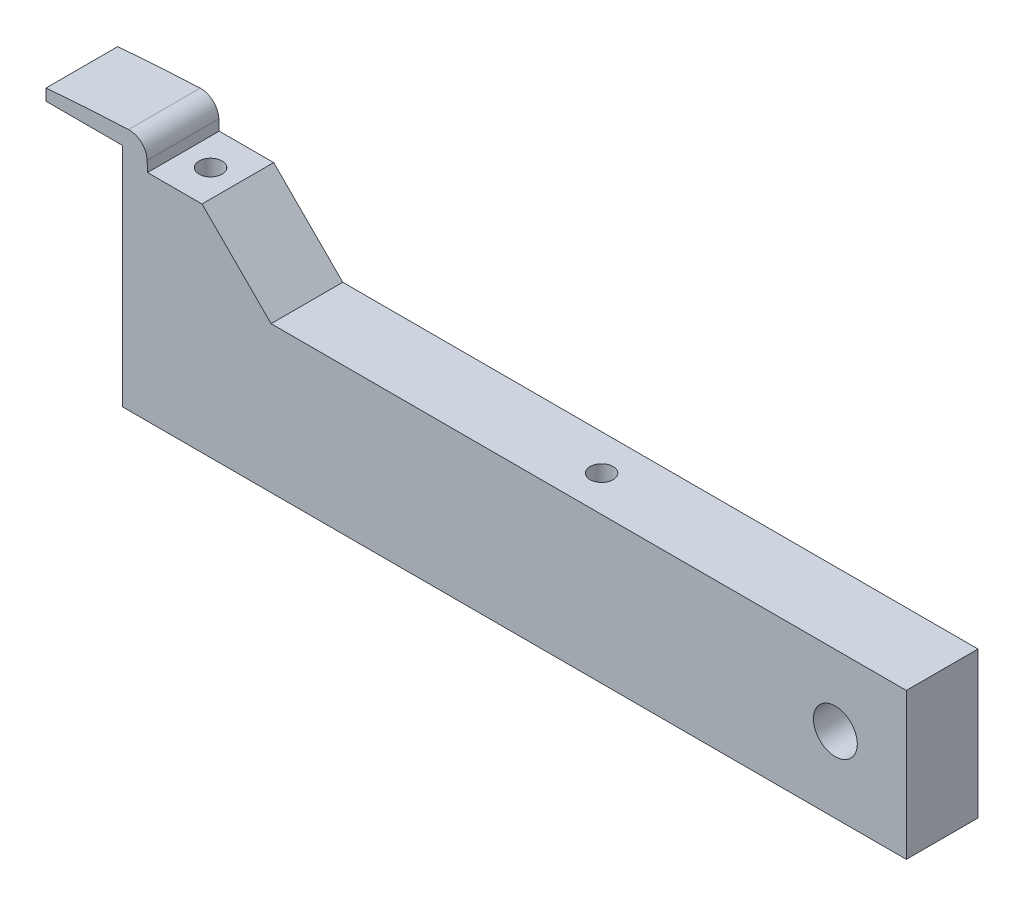
ISO-10303-21;
HEADER;
FILE_DESCRIPTION(('STEP AP214'),'2;1');
FILE_NAME('part.step','',(''),(''),'','','');
FILE_SCHEMA(('AUTOMOTIVE_DESIGN { 1 0 10303 214 1 1 1 1 }'));
ENDSEC;
DATA;
#1=APPLICATION_CONTEXT('core data for automotive mechanical design processes');
#2=APPLICATION_PROTOCOL_DEFINITION('international standard','automotive_design',2000,#1);
#3=PRODUCT_CONTEXT('',#1,'mechanical');
#4=PRODUCT('Part','Part','',(#3));
#5=PRODUCT_RELATED_PRODUCT_CATEGORY('part','',(#4));
#6=PRODUCT_DEFINITION_FORMATION('','',#4);
#7=PRODUCT_DEFINITION_CONTEXT('part definition',#1,'design');
#8=PRODUCT_DEFINITION('design','',#6,#7);
#9=PRODUCT_DEFINITION_SHAPE('','',#8);
#10=(LENGTH_UNIT() NAMED_UNIT(*) SI_UNIT(.MILLI.,.METRE.));
#11=(NAMED_UNIT(*) PLANE_ANGLE_UNIT() SI_UNIT($,.RADIAN.));
#12=(NAMED_UNIT(*) SI_UNIT($,.STERADIAN.) SOLID_ANGLE_UNIT());
#13=UNCERTAINTY_MEASURE_WITH_UNIT(LENGTH_MEASURE(1.E-05),#10,'distance_accuracy_value','');
#14=(GEOMETRIC_REPRESENTATION_CONTEXT(3) GLOBAL_UNCERTAINTY_ASSIGNED_CONTEXT((#13)) GLOBAL_UNIT_ASSIGNED_CONTEXT((#10,
#11,#12)) REPRESENTATION_CONTEXT('',''));
#15=CARTESIAN_POINT('',(0.,0.,0.));
#16=DIRECTION('',(0.,0.,1.));
#17=DIRECTION('',(1.,0.,0.));
#18=AXIS2_PLACEMENT_3D('',#15,#16,#17);
#19=CARTESIAN_POINT('',(2542.57497821714,2703.21219743126,12.7));
#20=DIRECTION('',(0.,0.,-1.));
#21=DIRECTION('',(-1.,0.,0.));
#22=AXIS2_PLACEMENT_3D('',#19,#20,#21);
#23=PLANE('',#22);
#24=CARTESIAN_POINT('',(2549.88795495903,2703.59831380378,12.7));
#25=CARTESIAN_POINT('',(2545.00956507517,2703.39023084145,12.7));
#26=CARTESIAN_POINT('',(2540.13612350104,2703.08863505272,12.7));
#27=CARTESIAN_POINT('',(2535.27480504948,2702.66266796378,12.7));
#28=B_SPLINE_CURVE_WITH_KNOTS('',3,(#24,#25,#26,#27),.UNSPECIFIED.,.F.,.F.,(4,4),
(10.936443719607,11.5143301556276),.UNSPECIFIED.);
#29=CARTESIAN_POINT('',(2549.88795495903,2703.59831380378,12.7));
#30=VERTEX_POINT('',#29);
#31=CARTESIAN_POINT('',(2535.27480504948,2702.66266796378,12.7));
#32=VERTEX_POINT('',#31);
#33=EDGE_CURVE('E179',#30,#32,#28,.T.);
#34=ORIENTED_EDGE('',*,*,#33,.T.);
#35=DIRECTION('',(6.54980501132204E-13,-1.,0.));
#36=VECTOR('',#35,1.);
#37=CARTESIAN_POINT('',(2535.27480504948,2700.62861103041,12.7));
#38=LINE('',#37,#36);
#39=CARTESIAN_POINT('',(2535.27480504948,2700.62861103041,12.7));
#40=VERTEX_POINT('',#39);
#41=EDGE_CURVE('E107',#32,#40,#38,.T.);
#42=ORIENTED_EDGE('',*,*,#41,.T.);
#43=DIRECTION('',(1.,0.,0.));
#44=VECTOR('',#43,1.);
#45=CARTESIAN_POINT('',(2548.86380504948,2700.62861103041,12.7));
#46=LINE('',#45,#44);
#47=CARTESIAN_POINT('',(2548.86380504948,2700.62861103041,12.7));
#48=VERTEX_POINT('',#47);
#49=EDGE_CURVE('E203',#40,#48,#46,.T.);
#50=ORIENTED_EDGE('',*,*,#49,.T.);
#51=DIRECTION('',(0.,-1.,0.));
#52=VECTOR('',#51,1.);
#53=CARTESIAN_POINT('',(2548.86380504948,2700.62861103041,12.7));
#54=LINE('',#53,#52);
#55=CARTESIAN_POINT('',(2548.86380504948,2660.52384388746,12.7));
#56=VERTEX_POINT('',#55);
#57=EDGE_CURVE('E222',#48,#56,#54,.T.);
#58=ORIENTED_EDGE('',*,*,#57,.T.);
#59=DIRECTION('',(1.,-1.31168694151421E-13,0.));
#60=VECTOR('',#59,1.);
#61=CARTESIAN_POINT('',(2548.86380504948,2660.52384388746,12.7));
#62=LINE('',#61,#60);
#63=CARTESIAN_POINT('',(2687.67480504948,2660.52384388744,12.7));
#64=VERTEX_POINT('',#63);
#65=EDGE_CURVE('E219',#56,#64,#62,.T.);
#66=ORIENTED_EDGE('',*,*,#65,.T.);
#67=DIRECTION('',(0.,1.,0.));
#68=VECTOR('',#67,1.);
#69=CARTESIAN_POINT('',(2687.67480504948,2686.44648764765,12.7));
#70=LINE('',#69,#68);
#71=CARTESIAN_POINT('',(2687.67480504948,2686.44648764765,12.7));
#72=VERTEX_POINT('',#71);
#73=EDGE_CURVE('E221',#64,#72,#70,.T.);
#74=ORIENTED_EDGE('',*,*,#73,.T.);
#75=DIRECTION('',(-1.,0.,0.));
#76=VECTOR('',#75,1.);
#77=CARTESIAN_POINT('',(2687.67480504948,2686.44648764765,12.7));
#78=LINE('',#77,#76);
#79=CARTESIAN_POINT('',(2575.14880706435,2686.44648764765,12.7));
#80=VERTEX_POINT('',#79);
#81=EDGE_CURVE('E224',#72,#80,#78,.T.);
#82=ORIENTED_EDGE('',*,*,#81,.T.);
#83=DIRECTION('',(-0.707106781186483,0.707106781186612,0.));
#84=VECTOR('',#83,1.);
#85=CARTESIAN_POINT('',(2562.90850772888,2698.68678698311,12.7));
#86=LINE('',#85,#84);
#87=CARTESIAN_POINT('',(2562.90850772888,2698.68678698311,12.7));
#88=VERTEX_POINT('',#87);
#89=EDGE_CURVE('E135',#80,#88,#86,.T.);
#90=ORIENTED_EDGE('',*,*,#89,.T.);
#91=DIRECTION('',(-1.,0.,0.));
#92=VECTOR('',#91,1.);
#93=CARTESIAN_POINT('',(2562.90850772888,2698.68678698311,12.7));
#94=LINE('',#93,#92);
#95=CARTESIAN_POINT('',(2553.25650772888,2698.68678698311,12.7));
#96=VERTEX_POINT('',#95);
#97=EDGE_CURVE('E129',#88,#96,#94,.T.);
#98=ORIENTED_EDGE('',*,*,#97,.T.);
#99=DIRECTION('',(-0.032505636242709,0.999471552177678,0.));
#100=VECTOR('',#99,1.);
#101=CARTESIAN_POINT('',(2553.25650772888,2698.68678698311,12.7));
#102=LINE('',#101,#100);
#103=CARTESIAN_POINT('',(2553.19658063808,2700.52940350697,12.7));
#104=VERTEX_POINT('',#103);
#105=EDGE_CURVE('E133',#96,#104,#102,.T.);
#106=ORIENTED_EDGE('',*,*,#105,.T.);
#107=CARTESIAN_POINT('',(2550.02325845992,2700.4261981119,12.7));
#108=DIRECTION('',(0.,0.,1.));
#109=DIRECTION('',(1.,0.,0.));
#110=AXIS2_PLACEMENT_3D('',#107,#108,#109);
#111=CIRCLE('',#110,3.17500000000008);
#112=EDGE_CURVE('E55',#104,#30,#111,.T.);
#113=ORIENTED_EDGE('',*,*,#112,.T.);
#114=EDGE_LOOP('',(#34,#42,#50,#58,#66,#74,#82,#90,#98,#106,#113));
#115=FACE_BOUND('',#114,.T.);
#116=CARTESIAN_POINT('',(2675.10583961434,2673.87752221251,12.7));
#117=DIRECTION('',(0.,0.,1.));
#118=DIRECTION('',(1.,0.,0.));
#119=AXIS2_PLACEMENT_3D('',#116,#117,#118);
#120=CIRCLE('',#119,3.88620000000017);
#121=CARTESIAN_POINT('',(2678.99203961434,2673.87752221251,12.7));
#122=VERTEX_POINT('',#121);
#123=EDGE_CURVE('E159',#122,#122,#120,.T.);
#124=ORIENTED_EDGE('',*,*,#123,.F.);
#125=EDGE_LOOP('',(#124));
#126=FACE_BOUND('',#125,.T.);
#127=ADVANCED_FACE('F37',(#115,#126),#23,.F.);
#128=CARTESIAN_POINT('',(2542.57497821714,2703.21219743126,0.));
#129=DIRECTION('',(0.,0.,-1.));
#130=DIRECTION('',(-1.,0.,0.));
#131=AXIS2_PLACEMENT_3D('',#128,#129,#130);
#132=PLANE('',#131);
#133=CARTESIAN_POINT('',(2549.88795495903,2703.59831380378,0.));
#134=CARTESIAN_POINT('',(2545.00956507517,2703.39023084145,0.));
#135=CARTESIAN_POINT('',(2540.13612350104,2703.08863505272,0.));
#136=CARTESIAN_POINT('',(2535.27480504948,2702.66266796378,0.));
#137=B_SPLINE_CURVE_WITH_KNOTS('',3,(#133,#134,#135,#136),.UNSPECIFIED.,.F.,.F.,(4,4),
(10.936443719607,11.5143301556276),.UNSPECIFIED.);
#138=CARTESIAN_POINT('',(2549.88795495903,2703.59831380378,0.));
#139=VERTEX_POINT('',#138);
#140=CARTESIAN_POINT('',(2535.27480504948,2702.66266796378,0.));
#141=VERTEX_POINT('',#140);
#142=EDGE_CURVE('E153',#139,#141,#137,.T.);
#143=ORIENTED_EDGE('',*,*,#142,.F.);
#144=CARTESIAN_POINT('',(2550.02325845992,2700.4261981119,0.));
#145=DIRECTION('',(0.,0.,1.));
#146=DIRECTION('',(1.,0.,0.));
#147=AXIS2_PLACEMENT_3D('',#144,#145,#146);
#148=CIRCLE('',#147,3.17500000000008);
#149=CARTESIAN_POINT('',(2553.19658063808,2700.52940350697,0.));
#150=VERTEX_POINT('',#149);
#151=EDGE_CURVE('E99',#150,#139,#148,.T.);
#152=ORIENTED_EDGE('',*,*,#151,.F.);
#153=DIRECTION('',(-0.032505636242709,0.999471552177678,0.));
#154=VECTOR('',#153,1.);
#155=CARTESIAN_POINT('',(2553.25650772888,2698.68678698311,0.));
#156=LINE('',#155,#154);
#157=CARTESIAN_POINT('',(2553.25650772888,2698.68678698311,0.));
#158=VERTEX_POINT('',#157);
#159=EDGE_CURVE('E93',#158,#150,#156,.T.);
#160=ORIENTED_EDGE('',*,*,#159,.F.);
#161=DIRECTION('',(-1.,0.,0.));
#162=VECTOR('',#161,1.);
#163=CARTESIAN_POINT('',(2562.90850772888,2698.68678698311,0.));
#164=LINE('',#163,#162);
#165=CARTESIAN_POINT('',(2562.90850772888,2698.68678698311,0.));
#166=VERTEX_POINT('',#165);
#167=EDGE_CURVE('E143',#166,#158,#164,.T.);
#168=ORIENTED_EDGE('',*,*,#167,.F.);
#169=DIRECTION('',(-0.707106781186483,0.707106781186612,0.));
#170=VECTOR('',#169,1.);
#171=CARTESIAN_POINT('',(2562.90850772888,2698.68678698311,0.));
#172=LINE('',#171,#170);
#173=CARTESIAN_POINT('',(2575.14880706435,2686.44648764765,0.));
#174=VERTEX_POINT('',#173);
#175=EDGE_CURVE('E174',#174,#166,#172,.T.);
#176=ORIENTED_EDGE('',*,*,#175,.F.);
#177=DIRECTION('',(-1.,0.,0.));
#178=VECTOR('',#177,1.);
#179=CARTESIAN_POINT('',(2687.67480504948,2686.44648764765,0.));
#180=LINE('',#179,#178);
#181=CARTESIAN_POINT('',(2687.67480504948,2686.44648764765,0.));
#182=VERTEX_POINT('',#181);
#183=EDGE_CURVE('E172',#182,#174,#180,.T.);
#184=ORIENTED_EDGE('',*,*,#183,.F.);
#185=DIRECTION('',(0.,1.,0.));
#186=VECTOR('',#185,1.);
#187=CARTESIAN_POINT('',(2687.67480504948,2686.44648764765,0.));
#188=LINE('',#187,#186);
#189=CARTESIAN_POINT('',(2687.67480504948,2660.52384388744,0.));
#190=VERTEX_POINT('',#189);
#191=EDGE_CURVE('E170',#190,#182,#188,.T.);
#192=ORIENTED_EDGE('',*,*,#191,.F.);
#193=DIRECTION('',(1.,-1.31168694151421E-13,0.));
#194=VECTOR('',#193,1.);
#195=CARTESIAN_POINT('',(2548.86380504948,2660.52384388746,0.));
#196=LINE('',#195,#194);
#197=CARTESIAN_POINT('',(2548.86380504948,2660.52384388746,0.));
#198=VERTEX_POINT('',#197);
#199=EDGE_CURVE('E168',#198,#190,#196,.T.);
#200=ORIENTED_EDGE('',*,*,#199,.F.);
#201=DIRECTION('',(0.,-1.,0.));
#202=VECTOR('',#201,1.);
#203=CARTESIAN_POINT('',(2548.86380504948,2700.62861103041,0.));
#204=LINE('',#203,#202);
#205=CARTESIAN_POINT('',(2548.86380504948,2700.62861103041,0.));
#206=VERTEX_POINT('',#205);
#207=EDGE_CURVE('E166',#206,#198,#204,.T.);
#208=ORIENTED_EDGE('',*,*,#207,.F.);
#209=DIRECTION('',(1.,0.,0.));
#210=VECTOR('',#209,1.);
#211=CARTESIAN_POINT('',(2548.86380504948,2700.62861103041,0.));
#212=LINE('',#211,#210);
#213=CARTESIAN_POINT('',(2535.27480504948,2700.62861103041,0.));
#214=VERTEX_POINT('',#213);
#215=EDGE_CURVE('E164',#214,#206,#212,.T.);
#216=ORIENTED_EDGE('',*,*,#215,.F.);
#217=DIRECTION('',(6.54980501132204E-13,-1.,0.));
#218=VECTOR('',#217,1.);
#219=CARTESIAN_POINT('',(2535.27480504948,2700.62861103041,0.));
#220=LINE('',#219,#218);
#221=EDGE_CURVE('E158',#141,#214,#220,.T.);
#222=ORIENTED_EDGE('',*,*,#221,.F.);
#223=EDGE_LOOP('',(#143,#152,#160,#168,#176,#184,#192,#200,#208,#216,#222));
#224=FACE_BOUND('',#223,.T.);
#225=CARTESIAN_POINT('',(2675.10583961434,2673.87752221251,0.));
#226=DIRECTION('',(0.,0.,1.));
#227=DIRECTION('',(1.,0.,0.));
#228=AXIS2_PLACEMENT_3D('',#225,#226,#227);
#229=CIRCLE('',#228,3.88620000000017);
#230=CARTESIAN_POINT('',(2678.99203961434,2673.87752221251,0.));
#231=VERTEX_POINT('',#230);
#232=EDGE_CURVE('E283',#231,#231,#229,.T.);
#233=ORIENTED_EDGE('',*,*,#232,.T.);
#234=EDGE_LOOP('',(#233));
#235=FACE_BOUND('',#234,.T.);
#236=ADVANCED_FACE('F207',(#224,#235),#132,.T.);
#237=DIRECTION('',(0.,0.,-1.));
#238=VECTOR('',#237,1.);
#239=SURFACE_OF_LINEAR_EXTRUSION('',#28,#238);
#240=ORIENTED_EDGE('',*,*,#142,.T.);
#241=DIRECTION('',(0.,0.,-1.));
#242=VECTOR('',#241,1.);
#243=CARTESIAN_POINT('',(2535.27480504948,2702.66266796378,12.7));
#244=LINE('',#243,#242);
#245=EDGE_CURVE('E11',#32,#141,#244,.T.);
#246=ORIENTED_EDGE('',*,*,#245,.F.);
#247=ORIENTED_EDGE('',*,*,#33,.F.);
#248=DIRECTION('',(0.,0.,-1.));
#249=VECTOR('',#248,1.);
#250=CARTESIAN_POINT('',(2549.88795495903,2703.59831380378,12.7));
#251=LINE('',#250,#249);
#252=EDGE_CURVE('E149',#30,#139,#251,.T.);
#253=ORIENTED_EDGE('',*,*,#252,.T.);
#254=EDGE_LOOP('',(#240,#246,#247,#253));
#255=FACE_BOUND('',#254,.T.);
#256=ADVANCED_FACE('F39',(#255),#239,.F.);
#257=CARTESIAN_POINT('',(2535.27480504948,2700.62861103041,12.7));
#258=DIRECTION('',(1.,6.54980501132204E-13,0.));
#259=DIRECTION('',(-6.54980501132204E-13,1.,0.));
#260=AXIS2_PLACEMENT_3D('',#257,#258,#259);
#261=PLANE('',#260);
#262=ORIENTED_EDGE('',*,*,#221,.T.);
#263=DIRECTION('',(0.,0.,-1.));
#264=VECTOR('',#263,1.);
#265=CARTESIAN_POINT('',(2535.27480504948,2700.62861103041,12.7));
#266=LINE('',#265,#264);
#267=EDGE_CURVE('E47',#40,#214,#266,.T.);
#268=ORIENTED_EDGE('',*,*,#267,.F.);
#269=ORIENTED_EDGE('',*,*,#41,.F.);
#270=ORIENTED_EDGE('',*,*,#245,.T.);
#271=EDGE_LOOP('',(#262,#268,#269,#270));
#272=FACE_BOUND('',#271,.T.);
#273=ADVANCED_FACE('F320',(#272),#261,.F.);
#274=CARTESIAN_POINT('',(2548.86380504948,2700.62861103041,12.7));
#275=DIRECTION('',(0.,1.,0.));
#276=DIRECTION('',(-1.,0.,0.));
#277=AXIS2_PLACEMENT_3D('',#274,#275,#276);
#278=PLANE('',#277);
#279=ORIENTED_EDGE('',*,*,#215,.T.);
#280=DIRECTION('',(0.,0.,-1.));
#281=VECTOR('',#280,1.);
#282=CARTESIAN_POINT('',(2548.86380504948,2700.62861103041,12.7));
#283=LINE('',#282,#281);
#284=EDGE_CURVE('E195',#48,#206,#283,.T.);
#285=ORIENTED_EDGE('',*,*,#284,.F.);
#286=ORIENTED_EDGE('',*,*,#49,.F.);
#287=ORIENTED_EDGE('',*,*,#267,.T.);
#288=EDGE_LOOP('',(#279,#285,#286,#287));
#289=FACE_BOUND('',#288,.T.);
#290=ADVANCED_FACE('F201',(#289),#278,.F.);
#291=CARTESIAN_POINT('',(2548.86380504948,2700.62861103041,12.7));
#292=DIRECTION('',(1.,0.,0.));
#293=DIRECTION('',(0.,0.,-1.));
#294=AXIS2_PLACEMENT_3D('',#291,#292,#293);
#295=PLANE('',#294);
#296=ORIENTED_EDGE('',*,*,#207,.T.);
#297=DIRECTION('',(0.,0.,-1.));
#298=VECTOR('',#297,1.);
#299=CARTESIAN_POINT('',(2548.86380504948,2660.52384388746,12.7));
#300=LINE('',#299,#298);
#301=EDGE_CURVE('E192',#56,#198,#300,.T.);
#302=ORIENTED_EDGE('',*,*,#301,.F.);
#303=ORIENTED_EDGE('',*,*,#57,.F.);
#304=ORIENTED_EDGE('',*,*,#284,.T.);
#305=EDGE_LOOP('',(#296,#302,#303,#304));
#306=FACE_BOUND('',#305,.T.);
#307=ADVANCED_FACE('F213',(#306),#295,.F.);
#308=CARTESIAN_POINT('',(2548.86380504948,2660.52384388746,12.7));
#309=DIRECTION('',(1.31168694151421E-13,1.,0.));
#310=DIRECTION('',(-1.,1.31168694151421E-13,0.));
#311=AXIS2_PLACEMENT_3D('',#308,#309,#310);
#312=PLANE('',#311);
#313=CARTESIAN_POINT('',(2558.08250772889,2660.52384388743,6.35));
#314=DIRECTION('',(0.,1.,0.));
#315=DIRECTION('',(-1.,0.,0.));
#316=AXIS2_PLACEMENT_3D('',#313,#314,#315);
#317=CIRCLE('',#316,2.03199999999978);
#318=CARTESIAN_POINT('',(2556.05050772889,2660.52384388743,6.35));
#319=VERTEX_POINT('',#318);
#320=EDGE_CURVE('E271',#319,#319,#317,.T.);
#321=ORIENTED_EDGE('',*,*,#320,.T.);
#322=EDGE_LOOP('',(#321));
#323=FACE_BOUND('',#322,.T.);
#324=CARTESIAN_POINT('',(2627.34980504948,2660.52384388744,6.35));
#325=DIRECTION('',(0.,1.,0.));
#326=DIRECTION('',(-1.,0.,0.));
#327=AXIS2_PLACEMENT_3D('',#324,#325,#326);
#328=CIRCLE('',#327,2.03199999999978);
#329=CARTESIAN_POINT('',(2625.31780504948,2660.52384388744,6.35));
#330=VERTEX_POINT('',#329);
#331=EDGE_CURVE('E280',#330,#330,#328,.T.);
#332=ORIENTED_EDGE('',*,*,#331,.T.);
#333=EDGE_LOOP('',(#332));
#334=FACE_BOUND('',#333,.T.);
#335=ORIENTED_EDGE('',*,*,#199,.T.);
#336=DIRECTION('',(0.,0.,-1.));
#337=VECTOR('',#336,1.);
#338=CARTESIAN_POINT('',(2687.67480504948,2660.52384388744,12.7));
#339=LINE('',#338,#337);
#340=EDGE_CURVE('E189',#64,#190,#339,.T.);
#341=ORIENTED_EDGE('',*,*,#340,.F.);
#342=ORIENTED_EDGE('',*,*,#65,.F.);
#343=ORIENTED_EDGE('',*,*,#301,.T.);
#344=EDGE_LOOP('',(#335,#341,#342,#343));
#345=FACE_BOUND('',#344,.T.);
#346=ADVANCED_FACE('F217',(#323,#334,#345),#312,.F.);
#347=CARTESIAN_POINT('',(2687.67480504948,2686.44648764765,12.7));
#348=DIRECTION('',(-1.,0.,0.));
#349=DIRECTION('',(0.,-1.,0.));
#350=AXIS2_PLACEMENT_3D('',#347,#348,#349);
#351=PLANE('',#350);
#352=ORIENTED_EDGE('',*,*,#191,.T.);
#353=DIRECTION('',(0.,0.,-1.));
#354=VECTOR('',#353,1.);
#355=CARTESIAN_POINT('',(2687.67480504948,2686.44648764765,12.7));
#356=LINE('',#355,#354);
#357=EDGE_CURVE('E186',#72,#182,#356,.T.);
#358=ORIENTED_EDGE('',*,*,#357,.F.);
#359=ORIENTED_EDGE('',*,*,#73,.F.);
#360=ORIENTED_EDGE('',*,*,#340,.T.);
#361=EDGE_LOOP('',(#352,#358,#359,#360));
#362=FACE_BOUND('',#361,.T.);
#363=ADVANCED_FACE('F303',(#362),#351,.F.);
#364=CARTESIAN_POINT('',(2687.67480504948,2686.44648764765,12.7));
#365=DIRECTION('',(0.,-1.,0.));
#366=DIRECTION('',(1.,0.,0.));
#367=AXIS2_PLACEMENT_3D('',#364,#365,#366);
#368=PLANE('',#367);
#369=CARTESIAN_POINT('',(2627.34980504948,2686.44648764765,6.35));
#370=DIRECTION('',(0.,1.,0.));
#371=DIRECTION('',(-1.,0.,0.));
#372=AXIS2_PLACEMENT_3D('',#369,#370,#371);
#373=CIRCLE('',#372,2.03199999999978);
#374=CARTESIAN_POINT('',(2625.31780504948,2686.44648764765,6.35));
#375=VERTEX_POINT('',#374);
#376=EDGE_CURVE('E277',#375,#375,#373,.T.);
#377=ORIENTED_EDGE('',*,*,#376,.F.);
#378=EDGE_LOOP('',(#377));
#379=FACE_BOUND('',#378,.T.);
#380=ORIENTED_EDGE('',*,*,#183,.T.);
#381=DIRECTION('',(0.,0.,-1.));
#382=VECTOR('',#381,1.);
#383=CARTESIAN_POINT('',(2575.14880706435,2686.44648764765,12.7));
#384=LINE('',#383,#382);
#385=EDGE_CURVE('E183',#80,#174,#384,.T.);
#386=ORIENTED_EDGE('',*,*,#385,.F.);
#387=ORIENTED_EDGE('',*,*,#81,.F.);
#388=ORIENTED_EDGE('',*,*,#357,.T.);
#389=EDGE_LOOP('',(#380,#386,#387,#388));
#390=FACE_BOUND('',#389,.T.);
#391=ADVANCED_FACE('F233',(#379,#390),#368,.F.);
#392=CARTESIAN_POINT('',(2562.90850772888,2698.68678698311,12.7));
#393=DIRECTION('',(-0.707106781186612,-0.707106781186483,0.));
#394=DIRECTION('',(0.707106781186483,-0.707106781186612,0.));
#395=AXIS2_PLACEMENT_3D('',#392,#393,#394);
#396=PLANE('',#395);
#397=ORIENTED_EDGE('',*,*,#175,.T.);
#398=DIRECTION('',(0.,0.,-1.));
#399=VECTOR('',#398,1.);
#400=CARTESIAN_POINT('',(2562.90850772888,2698.68678698311,12.7));
#401=LINE('',#400,#399);
#402=EDGE_CURVE('E144',#88,#166,#401,.T.);
#403=ORIENTED_EDGE('',*,*,#402,.F.);
#404=ORIENTED_EDGE('',*,*,#89,.F.);
#405=ORIENTED_EDGE('',*,*,#385,.T.);
#406=EDGE_LOOP('',(#397,#403,#404,#405));
#407=FACE_BOUND('',#406,.T.);
#408=ADVANCED_FACE('F237',(#407),#396,.F.);
#409=CARTESIAN_POINT('',(2562.90850772888,2698.68678698311,12.7));
#410=DIRECTION('',(0.,-1.,0.));
#411=DIRECTION('',(1.,0.,0.));
#412=AXIS2_PLACEMENT_3D('',#409,#410,#411);
#413=PLANE('',#412);
#414=CARTESIAN_POINT('',(2558.08250772888,2698.68678698311,6.35));
#415=DIRECTION('',(0.,1.,0.));
#416=DIRECTION('',(-1.,0.,0.));
#417=AXIS2_PLACEMENT_3D('',#414,#415,#416);
#418=CIRCLE('',#417,2.03199999999978);
#419=CARTESIAN_POINT('',(2556.05050772888,2698.68678698311,6.35));
#420=VERTEX_POINT('',#419);
#421=EDGE_CURVE('E274',#420,#420,#418,.T.);
#422=ORIENTED_EDGE('',*,*,#421,.F.);
#423=EDGE_LOOP('',(#422));
#424=FACE_BOUND('',#423,.T.);
#425=ORIENTED_EDGE('',*,*,#167,.T.);
#426=DIRECTION('',(0.,0.,-1.));
#427=VECTOR('',#426,1.);
#428=CARTESIAN_POINT('',(2553.25650772888,2698.68678698311,12.7));
#429=LINE('',#428,#427);
#430=EDGE_CURVE('E140',#96,#158,#429,.T.);
#431=ORIENTED_EDGE('',*,*,#430,.F.);
#432=ORIENTED_EDGE('',*,*,#97,.F.);
#433=ORIENTED_EDGE('',*,*,#402,.T.);
#434=EDGE_LOOP('',(#425,#431,#432,#433));
#435=FACE_BOUND('',#434,.T.);
#436=ADVANCED_FACE('F141',(#424,#435),#413,.F.);
#437=CARTESIAN_POINT('',(2553.25650772888,2698.68678698311,12.7));
#438=DIRECTION('',(-0.999471552177678,-0.032505636242709,0.));
#439=DIRECTION('',(0.032505636242709,-0.999471552177678,0.));
#440=AXIS2_PLACEMENT_3D('',#437,#438,#439);
#441=PLANE('',#440);
#442=ORIENTED_EDGE('',*,*,#159,.T.);
#443=DIRECTION('',(0.,0.,-1.));
#444=VECTOR('',#443,1.);
#445=CARTESIAN_POINT('',(2553.19658063808,2700.52940350697,12.7));
#446=LINE('',#445,#444);
#447=EDGE_CURVE('E145',#104,#150,#446,.T.);
#448=ORIENTED_EDGE('',*,*,#447,.F.);
#449=ORIENTED_EDGE('',*,*,#105,.F.);
#450=ORIENTED_EDGE('',*,*,#430,.T.);
#451=EDGE_LOOP('',(#442,#448,#449,#450));
#452=FACE_BOUND('',#451,.T.);
#453=ADVANCED_FACE('F147',(#452),#441,.F.);
#454=CARTESIAN_POINT('',(2550.02325845992,2700.4261981119,12.7));
#455=DIRECTION('',(0.,0.,-1.));
#456=DIRECTION('',(-1.,0.,0.));
#457=AXIS2_PLACEMENT_3D('',#454,#455,#456);
#458=CYLINDRICAL_SURFACE('',#457,3.17500000000008);
#459=ORIENTED_EDGE('',*,*,#151,.T.);
#460=ORIENTED_EDGE('',*,*,#252,.F.);
#461=ORIENTED_EDGE('',*,*,#112,.F.);
#462=ORIENTED_EDGE('',*,*,#447,.T.);
#463=EDGE_LOOP('',(#459,#460,#461,#462));
#464=FACE_BOUND('',#463,.T.);
#465=ADVANCED_FACE('F241',(#464),#458,.T.);
#466=CARTESIAN_POINT('',(2675.10583961434,2673.87752221251,12.7));
#467=DIRECTION('',(0.,0.,-1.));
#468=DIRECTION('',(-1.,0.,0.));
#469=AXIS2_PLACEMENT_3D('',#466,#467,#468);
#470=CYLINDRICAL_SURFACE('',#469,3.88620000000017);
#471=ORIENTED_EDGE('',*,*,#123,.T.);
#472=EDGE_LOOP('',(#471));
#473=FACE_BOUND('',#472,.T.);
#474=ORIENTED_EDGE('',*,*,#232,.F.);
#475=EDGE_LOOP('',(#474));
#476=FACE_BOUND('',#475,.T.);
#477=ADVANCED_FACE('F243',(#473,#476),#470,.F.);
#478=CARTESIAN_POINT('',(2627.34980504948,2660.52384388744,6.35));
#479=DIRECTION('',(0.,1.,0.));
#480=DIRECTION('',(-1.,0.,0.));
#481=AXIS2_PLACEMENT_3D('',#478,#479,#480);
#482=CYLINDRICAL_SURFACE('',#481,2.03199999999978);
#483=ORIENTED_EDGE('',*,*,#331,.F.);
#484=EDGE_LOOP('',(#483));
#485=FACE_BOUND('',#484,.T.);
#486=ORIENTED_EDGE('',*,*,#376,.T.);
#487=EDGE_LOOP('',(#486));
#488=FACE_BOUND('',#487,.T.);
#489=ADVANCED_FACE('F249',(#485,#488),#482,.F.);
#490=CARTESIAN_POINT('',(2558.08250772889,2660.52384388743,6.35));
#491=DIRECTION('',(0.,1.,0.));
#492=DIRECTION('',(-1.,0.,0.));
#493=AXIS2_PLACEMENT_3D('',#490,#491,#492);
#494=CYLINDRICAL_SURFACE('',#493,2.03199999999978);
#495=ORIENTED_EDGE('',*,*,#320,.F.);
#496=EDGE_LOOP('',(#495));
#497=FACE_BOUND('',#496,.T.);
#498=ORIENTED_EDGE('',*,*,#421,.T.);
#499=EDGE_LOOP('',(#498));
#500=FACE_BOUND('',#499,.T.);
#501=ADVANCED_FACE('F262',(#497,#500),#494,.F.);
#502=CLOSED_SHELL('',(#127,#236,#256,#273,#290,#307,#346,#363,#391,#408,#436,#453,#465,#477,
#489,#501));
#503=MANIFOLD_SOLID_BREP('B2',#502);
#504=ADVANCED_BREP_SHAPE_REPRESENTATION('',(#18,#503),#14);
#505=SHAPE_DEFINITION_REPRESENTATION(#9,#504);
ENDSEC;
END-ISO-10303-21;
